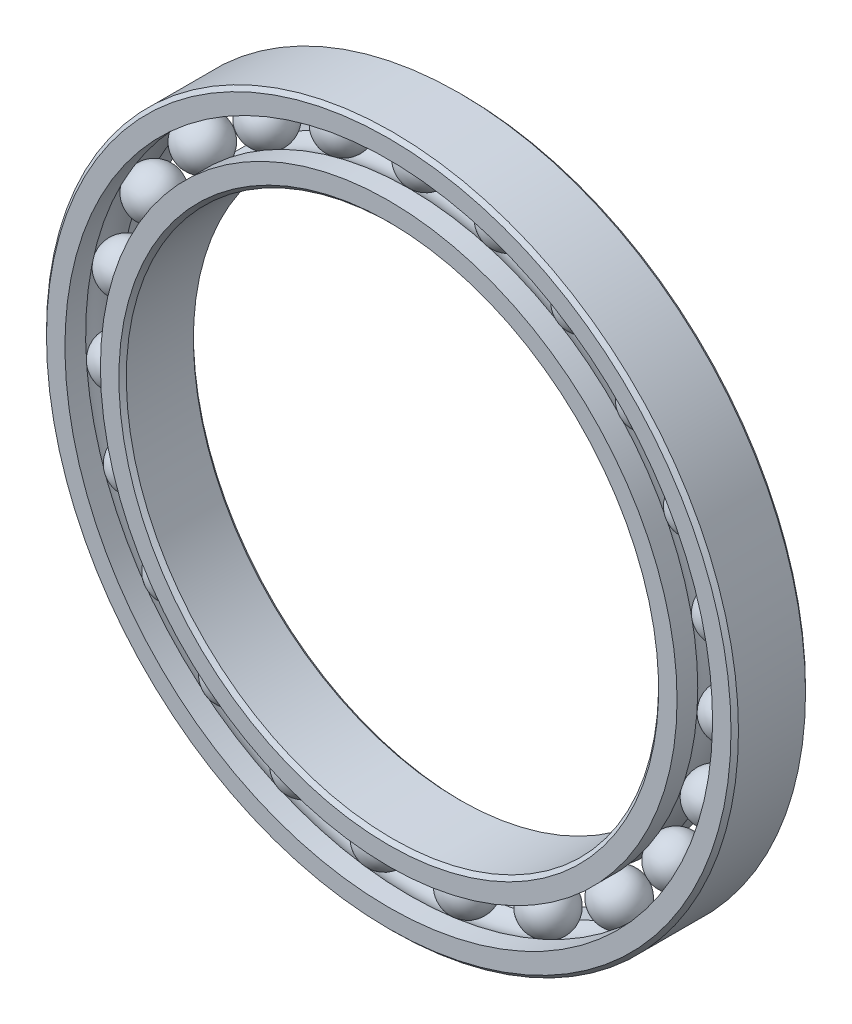
ISO-10303-21;
HEADER;
FILE_DESCRIPTION(('STEP AP214'),'2;1');
FILE_NAME('part.step','',(''),(''),'','','');
FILE_SCHEMA(('AUTOMOTIVE_DESIGN { 1 0 10303 214 1 1 1 1 }'));
ENDSEC;
DATA;
#1=APPLICATION_CONTEXT('core data for automotive mechanical design processes');
#2=APPLICATION_PROTOCOL_DEFINITION('international standard','automotive_design',2000,#1);
#3=PRODUCT_CONTEXT('',#1,'mechanical');
#4=PRODUCT('Part','Part','',(#3));
#5=PRODUCT_RELATED_PRODUCT_CATEGORY('part','',(#4));
#6=PRODUCT_DEFINITION_FORMATION('','',#4);
#7=PRODUCT_DEFINITION_CONTEXT('part definition',#1,'design');
#8=PRODUCT_DEFINITION('design','',#6,#7);
#9=PRODUCT_DEFINITION_SHAPE('','',#8);
#10=(LENGTH_UNIT() NAMED_UNIT(*) SI_UNIT(.MILLI.,.METRE.));
#11=(NAMED_UNIT(*) PLANE_ANGLE_UNIT() SI_UNIT($,.RADIAN.));
#12=(NAMED_UNIT(*) SI_UNIT($,.STERADIAN.) SOLID_ANGLE_UNIT());
#13=UNCERTAINTY_MEASURE_WITH_UNIT(LENGTH_MEASURE(1.E-05),#10,'distance_accuracy_value','');
#14=(GEOMETRIC_REPRESENTATION_CONTEXT(3) GLOBAL_UNCERTAINTY_ASSIGNED_CONTEXT((#13)) GLOBAL_UNIT_ASSIGNED_CONTEXT((#10,
#11,#12)) REPRESENTATION_CONTEXT('',''));
#15=CARTESIAN_POINT('',(0.,0.,0.));
#16=DIRECTION('',(0.,0.,1.));
#17=DIRECTION('',(1.,0.,0.));
#18=AXIS2_PLACEMENT_3D('',#15,#16,#17);
#19=CARTESIAN_POINT('',(7.75665717076408,27.6838720112493,0.));
#20=DIRECTION('',(0.,0.,1.));
#21=DIRECTION('',(0.269796771157012,0.962917287347803,0.));
#22=AXIS2_PLACEMENT_3D('',#19,#20,#21);
#23=SPHERICAL_SURFACE('',#22,2.27980939207591);
#24=CARTESIAN_POINT('',(7.75665717076408,27.6838720112493,2.27980939207591));
#25=VERTEX_POINT('',#24);
#26=VERTEX_LOOP('',#25);
#27=FACE_BOUND('',#26,.T.);
#28=ADVANCED_FACE('F42',(#27),#23,.T.);
#29=CLOSED_SHELL('',(#28));
#30=MANIFOLD_SOLID_BREP('B2',#29);
#31=CARTESIAN_POINT('',(14.9380385635184,24.5645578807117,0.));
#32=DIRECTION('',(0.,0.,1.));
#33=DIRECTION('',(0.519583950035423,0.854419404546495,0.));
#34=AXIS2_PLACEMENT_3D('',#31,#32,#33);
#35=SPHERICAL_SURFACE('',#34,2.27980939207591);
#36=CARTESIAN_POINT('',(14.9380385635184,24.5645578807117,2.27980939207591));
#37=VERTEX_POINT('',#36);
#38=VERTEX_LOOP('',#37);
#39=FACE_BOUND('',#38,.T.);
#40=ADVANCED_FACE('F59',(#39),#35,.T.);
#41=CLOSED_SHELL('',(#40));
#42=MANIFOLD_SOLID_BREP('B6',#41);
#43=CARTESIAN_POINT('',(21.0115339729958,19.6234028675366,0.));
#44=DIRECTION('',(0.,0.,1.));
#45=DIRECTION('',(0.730835964278116,0.682553143218663,0.));
#46=AXIS2_PLACEMENT_3D('',#43,#44,#45);
#47=SPHERICAL_SURFACE('',#46,2.27980939207591);
#48=CARTESIAN_POINT('',(21.0115339729958,19.6234028675366,2.27980939207591));
#49=VERTEX_POINT('',#48);
#50=VERTEX_LOOP('',#49);
#51=FACE_BOUND('',#50,.T.);
#52=ADVANCED_FACE('F76',(#51),#47,.T.);
#53=CLOSED_SHELL('',(#52));
#54=MANIFOLD_SOLID_BREP('B38',#53);
#55=CARTESIAN_POINT('',(25.5267000290681,13.2268698347709,0.));
#56=DIRECTION('',(0.,0.,1.));
#57=DIRECTION('',(0.88788521840237,0.460065037731162,0.));
#58=AXIS2_PLACEMENT_3D('',#55,#56,#57);
#59=SPHERICAL_SURFACE('',#58,2.27980939207591);
#60=CARTESIAN_POINT('',(25.5267000290681,13.2268698347709,2.27980939207591));
#61=VERTEX_POINT('',#60);
#62=VERTEX_LOOP('',#61);
#63=FACE_BOUND('',#62,.T.);
#64=ADVANCED_FACE('F93',(#63),#59,.T.);
#65=CLOSED_SHELL('',(#64));
#66=MANIFOLD_SOLID_BREP('B55',#65);
#67=CARTESIAN_POINT('',(28.1486675208667,5.84936037526353,0.));
#68=DIRECTION('',(0.,0.,1.));
#69=DIRECTION('',(0.979084087682321,0.203456013052645,0.));
#70=AXIS2_PLACEMENT_3D('',#67,#68,#69);
#71=SPHERICAL_SURFACE('',#70,2.27980939207591);
#72=CARTESIAN_POINT('',(28.1486675208667,5.84936037526353,2.2798093920759));
#73=VERTEX_POINT('',#72);
#74=VERTEX_LOOP('',#73);
#75=FACE_BOUND('',#74,.T.);
#76=ADVANCED_FACE('F110',(#75),#71,.T.);
#77=CLOSED_SHELL('',(#76));
#78=MANIFOLD_SOLID_BREP('B72',#77);
#79=CARTESIAN_POINT('',(28.682977114228,-1.961969384234,0.));
#80=DIRECTION('',(0.,0.,1.));
#81=DIRECTION('',(0.99766876919054,-0.0682424133646607,0.));
#82=AXIS2_PLACEMENT_3D('',#79,#80,#81);
#83=SPHERICAL_SURFACE('',#82,2.27980939207591);
#84=CARTESIAN_POINT('',(28.682977114228,-1.961969384234,2.2798093920759));
#85=VERTEX_POINT('',#84);
#86=VERTEX_LOOP('',#85);
#87=FACE_BOUND('',#86,.T.);
#88=ADVANCED_FACE('F127',(#87),#83,.T.);
#89=CLOSED_SHELL('',(#88));
#90=MANIFOLD_SOLID_BREP('B89',#89);
#91=CARTESIAN_POINT('',(27.0900015109162,-9.62778884991559,0.));
#92=DIRECTION('',(0.,0.,1.));
#93=DIRECTION('',(0.942260922118824,-0.334879612170977,0.));
#94=AXIS2_PLACEMENT_3D('',#91,#92,#93);
#95=SPHERICAL_SURFACE('',#94,2.27980939207591);
#96=CARTESIAN_POINT('',(27.0900015109162,-9.62778884991559,2.2798093920759));
#97=VERTEX_POINT('',#96);
#98=VERTEX_LOOP('',#97);
#99=FACE_BOUND('',#98,.T.);
#100=ADVANCED_FACE('F144',(#99),#95,.T.);
#101=CLOSED_SHELL('',(#100));
#102=MANIFOLD_SOLID_BREP('B106',#101);
#103=CARTESIAN_POINT('',(23.4878844240504,-16.5795592608022,0.));
#104=DIRECTION('',(0.,0.,1.));
#105=DIRECTION('',(0.816969893010447,-0.57668032211486,0.));
#106=AXIS2_PLACEMENT_3D('',#103,#104,#105);
#107=SPHERICAL_SURFACE('',#106,2.27980939207591);
#108=CARTESIAN_POINT('',(23.4878844240504,-16.5795592608022,2.2798093920759));
#109=VERTEX_POINT('',#108);
#110=VERTEX_LOOP('',#109);
#111=FACE_BOUND('',#110,.T.);
#112=ADVANCED_FACE('F161',(#111),#107,.T.);
#113=CLOSED_SHELL('',(#112));
#114=MANIFOLD_SOLID_BREP('B123',#113);
#115=CARTESIAN_POINT('',(18.1437783993742,-22.3016996077519,0.));
#116=DIRECTION('',(0.,0.,1.));
#117=DIRECTION('',(0.631087944326059,-0.775711290704414,0.));
#118=AXIS2_PLACEMENT_3D('',#115,#116,#117);
#119=SPHERICAL_SURFACE('',#118,2.27980939207591);
#120=CARTESIAN_POINT('',(18.1437783993742,-22.3016996077519,2.2798093920759));
#121=VERTEX_POINT('',#120);
#122=VERTEX_LOOP('',#121);
#123=FACE_BOUND('',#122,.T.);
#124=ADVANCED_FACE('F178',(#123),#119,.T.);
#125=CLOSED_SHELL('',(#124));
#126=MANIFOLD_SOLID_BREP('B140',#125);
#127=CARTESIAN_POINT('',(11.4540313330796,-26.3698249182817,0.));
#128=DIRECTION('',(0.,0.,1.));
#129=DIRECTION('',(0.398401089846249,-0.91721130150545,0.));
#130=AXIS2_PLACEMENT_3D('',#127,#128,#129);
#131=SPHERICAL_SURFACE('',#130,2.27980939207591);
#132=CARTESIAN_POINT('',(11.4540313330796,-26.3698249182817,2.2798093920759));
#133=VERTEX_POINT('',#132);
#134=VERTEX_LOOP('',#133);
#135=FACE_BOUND('',#134,.T.);
#136=ADVANCED_FACE('F195',(#135),#131,.T.);
#137=CLOSED_SHELL('',(#136));
#138=MANIFOLD_SOLID_BREP('B157',#137);
#139=CARTESIAN_POINT('',(3.9147911615173,-28.4822209485445,0.));
#140=DIRECTION('',(0.,0.,1.));
#141=DIRECTION('',(0.136166649096254,-0.99068594603633,0.));
#142=AXIS2_PLACEMENT_3D('',#139,#140,#141);
#143=SPHERICAL_SURFACE('',#142,2.27980939207591);
#144=CARTESIAN_POINT('',(3.9147911615173,-28.4822209485445,2.2798093920759));
#145=VERTEX_POINT('',#144);
#146=VERTEX_LOOP('',#145);
#147=FACE_BOUND('',#146,.T.);
#148=ADVANCED_FACE('F212',(#147),#143,.T.);
#149=CLOSED_SHELL('',(#148));
#150=MANIFOLD_SOLID_BREP('B174',#149);
#151=CARTESIAN_POINT('',(-3.9147911615169,-28.4822209485445,0.));
#152=DIRECTION('',(0.,0.,1.));
#153=DIRECTION('',(-0.13616664909624,-0.990685946036332,0.));
#154=AXIS2_PLACEMENT_3D('',#151,#152,#153);
#155=SPHERICAL_SURFACE('',#154,2.27980939207591);
#156=CARTESIAN_POINT('',(-3.9147911615169,-28.4822209485445,2.2798093920759));
#157=VERTEX_POINT('',#156);
#158=VERTEX_LOOP('',#157);
#159=FACE_BOUND('',#158,.T.);
#160=ADVANCED_FACE('F229',(#159),#155,.T.);
#161=CLOSED_SHELL('',(#160));
#162=MANIFOLD_SOLID_BREP('B191',#161);
#163=CARTESIAN_POINT('',(-11.4540313330793,-26.3698249182818,0.));
#164=DIRECTION('',(0.,0.,1.));
#165=DIRECTION('',(-0.398401089846236,-0.917211301505455,0.));
#166=AXIS2_PLACEMENT_3D('',#163,#164,#165);
#167=SPHERICAL_SURFACE('',#166,2.27980939207591);
#168=CARTESIAN_POINT('',(-11.4540313330793,-26.3698249182818,2.2798093920759));
#169=VERTEX_POINT('',#168);
#170=VERTEX_LOOP('',#169);
#171=FACE_BOUND('',#170,.T.);
#172=ADVANCED_FACE('F246',(#171),#167,.T.);
#173=CLOSED_SHELL('',(#172));
#174=MANIFOLD_SOLID_BREP('B208',#173);
#175=CARTESIAN_POINT('',(-18.1437783993739,-22.3016996077522,0.));
#176=DIRECTION('',(0.,0.,1.));
#177=DIRECTION('',(-0.631087944326049,-0.775711290704423,0.));
#178=AXIS2_PLACEMENT_3D('',#175,#176,#177);
#179=SPHERICAL_SURFACE('',#178,2.27980939207591);
#180=CARTESIAN_POINT('',(-18.1437783993739,-22.3016996077522,2.2798093920759));
#181=VERTEX_POINT('',#180);
#182=VERTEX_LOOP('',#181);
#183=FACE_BOUND('',#182,.T.);
#184=ADVANCED_FACE('F263',(#183),#179,.T.);
#185=CLOSED_SHELL('',(#184));
#186=MANIFOLD_SOLID_BREP('B225',#185);
#187=CARTESIAN_POINT('',(-23.4878844240501,-16.5795592608025,0.));
#188=DIRECTION('',(0.,0.,1.));
#189=DIRECTION('',(-0.816969893010439,-0.576680322114871,0.));
#190=AXIS2_PLACEMENT_3D('',#187,#188,#189);
#191=SPHERICAL_SURFACE('',#190,2.27980939207591);
#192=CARTESIAN_POINT('',(-23.4878844240501,-16.5795592608025,2.2798093920759));
#193=VERTEX_POINT('',#192);
#194=VERTEX_LOOP('',#193);
#195=FACE_BOUND('',#194,.T.);
#196=ADVANCED_FACE('F280',(#195),#191,.T.);
#197=CLOSED_SHELL('',(#196));
#198=MANIFOLD_SOLID_BREP('B242',#197);
#199=CARTESIAN_POINT('',(-27.0900015109161,-9.62778884991597,0.));
#200=DIRECTION('',(0.,0.,1.));
#201=DIRECTION('',(-0.942260922118819,-0.33487961217099,0.));
#202=AXIS2_PLACEMENT_3D('',#199,#200,#201);
#203=SPHERICAL_SURFACE('',#202,2.27980939207591);
#204=CARTESIAN_POINT('',(-27.0900015109161,-9.62778884991597,2.2798093920759));
#205=VERTEX_POINT('',#204);
#206=VERTEX_LOOP('',#205);
#207=FACE_BOUND('',#206,.T.);
#208=ADVANCED_FACE('F297',(#207),#203,.T.);
#209=CLOSED_SHELL('',(#208));
#210=MANIFOLD_SOLID_BREP('B259',#209);
#211=CARTESIAN_POINT('',(-28.682977114228,-1.9619693842344,0.));
#212=DIRECTION('',(0.,0.,1.));
#213=DIRECTION('',(-0.997668769190539,-0.0682424133646747,0.));
#214=AXIS2_PLACEMENT_3D('',#211,#212,#213);
#215=SPHERICAL_SURFACE('',#214,2.27980939207591);
#216=CARTESIAN_POINT('',(-28.682977114228,-1.9619693842344,2.2798093920759));
#217=VERTEX_POINT('',#216);
#218=VERTEX_LOOP('',#217);
#219=FACE_BOUND('',#218,.T.);
#220=ADVANCED_FACE('F314',(#219),#215,.T.);
#221=CLOSED_SHELL('',(#220));
#222=MANIFOLD_SOLID_BREP('B276',#221);
#223=CARTESIAN_POINT('',(-28.1486675208668,5.84936037526314,0.));
#224=DIRECTION('',(0.,0.,1.));
#225=DIRECTION('',(-0.979084087682323,0.203456013052631,0.));
#226=AXIS2_PLACEMENT_3D('',#223,#224,#225);
#227=SPHERICAL_SURFACE('',#226,2.27980939207591);
#228=CARTESIAN_POINT('',(-28.1486675208668,5.84936037526314,2.2798093920759));
#229=VERTEX_POINT('',#228);
#230=VERTEX_LOOP('',#229);
#231=FACE_BOUND('',#230,.T.);
#232=ADVANCED_FACE('F331',(#231),#227,.T.);
#233=CLOSED_SHELL('',(#232));
#234=MANIFOLD_SOLID_BREP('B293',#233);
#235=CARTESIAN_POINT('',(-25.5267000290683,13.2268698347706,0.));
#236=DIRECTION('',(0.,0.,1.));
#237=DIRECTION('',(-0.887885218402376,0.46006503773115,0.));
#238=AXIS2_PLACEMENT_3D('',#235,#236,#237);
#239=SPHERICAL_SURFACE('',#238,2.27980939207591);
#240=CARTESIAN_POINT('',(-25.5267000290683,13.2268698347706,2.27980939207591));
#241=VERTEX_POINT('',#240);
#242=VERTEX_LOOP('',#241);
#243=FACE_BOUND('',#242,.T.);
#244=ADVANCED_FACE('F348',(#243),#239,.T.);
#245=CLOSED_SHELL('',(#244));
#246=MANIFOLD_SOLID_BREP('B310',#245);
#247=CARTESIAN_POINT('',(-21.0115339729961,19.6234028675363,0.));
#248=DIRECTION('',(0.,0.,1.));
#249=DIRECTION('',(-0.730835964278125,0.682553143218653,0.));
#250=AXIS2_PLACEMENT_3D('',#247,#248,#249);
#251=SPHERICAL_SURFACE('',#250,2.27980939207591);
#252=CARTESIAN_POINT('',(-21.0115339729961,19.6234028675363,2.27980939207591));
#253=VERTEX_POINT('',#252);
#254=VERTEX_LOOP('',#253);
#255=FACE_BOUND('',#254,.T.);
#256=ADVANCED_FACE('F365',(#255),#251,.T.);
#257=CLOSED_SHELL('',(#256));
#258=MANIFOLD_SOLID_BREP('B327',#257);
#259=CARTESIAN_POINT('',(-14.9380385635187,24.5645578807115,0.));
#260=DIRECTION('',(0.,0.,1.));
#261=DIRECTION('',(-0.519583950035435,0.854419404546488,0.));
#262=AXIS2_PLACEMENT_3D('',#259,#260,#261);
#263=SPHERICAL_SURFACE('',#262,2.27980939207591);
#264=CARTESIAN_POINT('',(-14.9380385635187,24.5645578807115,2.27980939207591));
#265=VERTEX_POINT('',#264);
#266=VERTEX_LOOP('',#265);
#267=FACE_BOUND('',#266,.T.);
#268=ADVANCED_FACE('F382',(#267),#263,.T.);
#269=CLOSED_SHELL('',(#268));
#270=MANIFOLD_SOLID_BREP('B344',#269);
#271=CARTESIAN_POINT('',(-7.75665717076446,27.6838720112492,0.));
#272=DIRECTION('',(0.,0.,1.));
#273=DIRECTION('',(-0.269796771157025,0.962917287347799,0.));
#274=AXIS2_PLACEMENT_3D('',#271,#272,#273);
#275=SPHERICAL_SURFACE('',#274,2.27980939207591);
#276=CARTESIAN_POINT('',(-7.75665717076446,27.6838720112492,2.27980939207591));
#277=VERTEX_POINT('',#276);
#278=VERTEX_LOOP('',#277);
#279=FACE_BOUND('',#278,.T.);
#280=ADVANCED_FACE('F399',(#279),#275,.T.);
#281=CLOSED_SHELL('',(#280));
#282=MANIFOLD_SOLID_BREP('B361',#281);
#283=CARTESIAN_POINT('',(0.,28.75,0.));
#284=DIRECTION('',(0.,0.,1.));
#285=DIRECTION('',(0.,1.,0.));
#286=AXIS2_PLACEMENT_3D('',#283,#284,#285);
#287=SPHERICAL_SURFACE('',#286,2.27980939207591);
#288=CARTESIAN_POINT('',(0.,28.75,2.27980939207591));
#289=VERTEX_POINT('',#288);
#290=VERTEX_LOOP('',#289);
#291=FACE_BOUND('',#290,.T.);
#292=ADVANCED_FACE('F418',(#291),#287,.T.);
#293=CLOSED_SHELL('',(#292));
#294=MANIFOLD_SOLID_BREP('B378',#293);
#295=CARTESIAN_POINT('',(0.,27.0833333333333,3.50000000000001));
#296=DIRECTION('',(0.,0.,-1.));
#297=DIRECTION('',(0.,1.,0.));
#298=AXIS2_PLACEMENT_3D('',#295,#296,#297);
#299=PLANE('',#298);
#300=CARTESIAN_POINT('',(0.,0.,3.5));
#301=DIRECTION('',(0.,0.,1.));
#302=DIRECTION('',(0.,-1.,0.));
#303=AXIS2_PLACEMENT_3D('',#300,#301,#302);
#304=CIRCLE('',#303,25.35);
#305=CARTESIAN_POINT('',(0.,-25.35,3.5));
#306=VERTEX_POINT('',#305);
#307=EDGE_CURVE('E464',#306,#306,#304,.T.);
#308=ORIENTED_EDGE('',*,*,#307,.F.);
#309=EDGE_LOOP('',(#308));
#310=FACE_BOUND('',#309,.T.);
#311=CARTESIAN_POINT('',(0.,0.,3.5));
#312=DIRECTION('',(0.,0.,1.));
#313=DIRECTION('',(0.,-1.,0.));
#314=AXIS2_PLACEMENT_3D('',#311,#312,#313);
#315=CIRCLE('',#314,27.0833333333333);
#316=CARTESIAN_POINT('',(0.,-27.0833333333333,3.5));
#317=VERTEX_POINT('',#316);
#318=EDGE_CURVE('E417',#317,#317,#315,.T.);
#319=ORIENTED_EDGE('',*,*,#318,.T.);
#320=EDGE_LOOP('',(#319));
#321=FACE_BOUND('',#320,.T.);
#322=ADVANCED_FACE('F436',(#310,#321),#299,.F.);
#323=CARTESIAN_POINT('',(0.,0.,3.49999999999999));
#324=DIRECTION('',(0.,0.,1.));
#325=DIRECTION('',(0.,-1.,0.));
#326=AXIS2_PLACEMENT_3D('',#323,#324,#325);
#327=CYLINDRICAL_SURFACE('',#326,27.0833333333333);
#328=ORIENTED_EDGE('',*,*,#318,.F.);
#329=EDGE_LOOP('',(#328));
#330=FACE_BOUND('',#329,.T.);
#331=CARTESIAN_POINT('',(0.,0.,1.55555555555555));
#332=DIRECTION('',(0.,0.,1.));
#333=DIRECTION('',(0.,-1.,0.));
#334=AXIS2_PLACEMENT_3D('',#331,#332,#333);
#335=CIRCLE('',#334,27.0833333333333);
#336=CARTESIAN_POINT('',(0.,-27.0833333333333,1.55555555555555));
#337=VERTEX_POINT('',#336);
#338=EDGE_CURVE('E442',#337,#337,#335,.T.);
#339=ORIENTED_EDGE('',*,*,#338,.T.);
#340=EDGE_LOOP('',(#339));
#341=FACE_BOUND('',#340,.T.);
#342=ADVANCED_FACE('F471',(#330,#341),#327,.T.);
#343=CARTESIAN_POINT('',(0.,0.,0.));
#344=DIRECTION('',(0.,0.,1.));
#345=DIRECTION('',(0.,-1.,0.));
#346=AXIS2_PLACEMENT_3D('',#343,#344,#345);
#347=TOROIDAL_SURFACE('',#346,28.75,2.27980939207591);
#348=ORIENTED_EDGE('',*,*,#338,.F.);
#349=EDGE_LOOP('',(#348));
#350=FACE_BOUND('',#349,.T.);
#351=CARTESIAN_POINT('',(0.,0.,-1.55555555555556));
#352=DIRECTION('',(0.,0.,1.));
#353=DIRECTION('',(0.,-1.,0.));
#354=AXIS2_PLACEMENT_3D('',#351,#352,#353);
#355=CIRCLE('',#354,27.0833333333333);
#356=CARTESIAN_POINT('',(0.,-27.0833333333333,-1.55555555555556));
#357=VERTEX_POINT('',#356);
#358=EDGE_CURVE('E446',#357,#357,#355,.T.);
#359=ORIENTED_EDGE('',*,*,#358,.T.);
#360=EDGE_LOOP('',(#359));
#361=FACE_BOUND('',#360,.T.);
#362=ADVANCED_FACE('F475',(#350,#361),#347,.F.);
#363=CARTESIAN_POINT('',(0.,0.,3.49999999999999));
#364=DIRECTION('',(0.,0.,1.));
#365=DIRECTION('',(0.,-1.,0.));
#366=AXIS2_PLACEMENT_3D('',#363,#364,#365);
#367=CYLINDRICAL_SURFACE('',#366,27.0833333333333);
#368=ORIENTED_EDGE('',*,*,#358,.F.);
#369=EDGE_LOOP('',(#368));
#370=FACE_BOUND('',#369,.T.);
#371=CARTESIAN_POINT('',(0.,0.,-3.50000000000001));
#372=DIRECTION('',(0.,0.,1.));
#373=DIRECTION('',(0.,-1.,0.));
#374=AXIS2_PLACEMENT_3D('',#371,#372,#373);
#375=CIRCLE('',#374,27.0833333333333);
#376=CARTESIAN_POINT('',(0.,-27.0833333333333,-3.50000000000002));
#377=VERTEX_POINT('',#376);
#378=EDGE_CURVE('E450',#377,#377,#375,.T.);
#379=ORIENTED_EDGE('',*,*,#378,.T.);
#380=EDGE_LOOP('',(#379));
#381=FACE_BOUND('',#380,.T.);
#382=ADVANCED_FACE('F480',(#370,#381),#367,.T.);
#383=CARTESIAN_POINT('',(0.,25.35,-3.50000000000001));
#384=DIRECTION('',(0.,0.,1.));
#385=DIRECTION('',(0.,-1.,0.));
#386=AXIS2_PLACEMENT_3D('',#383,#384,#385);
#387=PLANE('',#386);
#388=ORIENTED_EDGE('',*,*,#378,.F.);
#389=EDGE_LOOP('',(#388));
#390=FACE_BOUND('',#389,.T.);
#391=CARTESIAN_POINT('',(0.,0.,-3.50000000000002));
#392=DIRECTION('',(0.,0.,1.));
#393=DIRECTION('',(0.,-1.,0.));
#394=AXIS2_PLACEMENT_3D('',#391,#392,#393);
#395=CIRCLE('',#394,25.35);
#396=CARTESIAN_POINT('',(0.,-25.35,-3.50000000000002));
#397=VERTEX_POINT('',#396);
#398=EDGE_CURVE('E455',#397,#397,#395,.T.);
#399=ORIENTED_EDGE('',*,*,#398,.T.);
#400=EDGE_LOOP('',(#399));
#401=FACE_BOUND('',#400,.T.);
#402=ADVANCED_FACE('F486',(#390,#401),#387,.F.);
#403=CARTESIAN_POINT('',(0.,0.,-3.15000000000001));
#404=DIRECTION('',(0.,0.,-1.));
#405=DIRECTION('',(0.,1.,0.));
#406=AXIS2_PLACEMENT_3D('',#403,#404,#405);
#407=CONICAL_SURFACE('',#406,25.,0.785398163397416);
#408=ORIENTED_EDGE('',*,*,#398,.F.);
#409=EDGE_LOOP('',(#408));
#410=FACE_BOUND('',#409,.T.);
#411=CARTESIAN_POINT('',(0.,0.,-3.15000000000001));
#412=DIRECTION('',(0.,0.,1.));
#413=DIRECTION('',(0.,-1.,0.));
#414=AXIS2_PLACEMENT_3D('',#411,#412,#413);
#415=CIRCLE('',#414,25.);
#416=CARTESIAN_POINT('',(0.,-25.,-3.15000000000001));
#417=VERTEX_POINT('',#416);
#418=EDGE_CURVE('E458',#417,#417,#415,.T.);
#419=ORIENTED_EDGE('',*,*,#418,.T.);
#420=EDGE_LOOP('',(#419));
#421=FACE_BOUND('',#420,.T.);
#422=ADVANCED_FACE('F490',(#410,#421),#407,.F.);
#423=CARTESIAN_POINT('',(0.,0.,3.49999999999999));
#424=DIRECTION('',(0.,0.,1.));
#425=DIRECTION('',(0.,-1.,0.));
#426=AXIS2_PLACEMENT_3D('',#423,#424,#425);
#427=CYLINDRICAL_SURFACE('',#426,25.);
#428=ORIENTED_EDGE('',*,*,#418,.F.);
#429=EDGE_LOOP('',(#428));
#430=FACE_BOUND('',#429,.T.);
#431=CARTESIAN_POINT('',(0.,0.,3.15000000000002));
#432=DIRECTION('',(0.,0.,1.));
#433=DIRECTION('',(0.,-1.,0.));
#434=AXIS2_PLACEMENT_3D('',#431,#432,#433);
#435=CIRCLE('',#434,25.);
#436=CARTESIAN_POINT('',(0.,-25.,3.15000000000002));
#437=VERTEX_POINT('',#436);
#438=EDGE_CURVE('E461',#437,#437,#435,.T.);
#439=ORIENTED_EDGE('',*,*,#438,.T.);
#440=EDGE_LOOP('',(#439));
#441=FACE_BOUND('',#440,.T.);
#442=ADVANCED_FACE('F494',(#430,#441),#427,.F.);
#443=CARTESIAN_POINT('',(0.,0.,3.5));
#444=DIRECTION('',(0.,0.,1.));
#445=DIRECTION('',(0.,-1.,0.));
#446=AXIS2_PLACEMENT_3D('',#443,#444,#445);
#447=CONICAL_SURFACE('',#446,25.35,0.785398163397474);
#448=ORIENTED_EDGE('',*,*,#438,.F.);
#449=EDGE_LOOP('',(#448));
#450=FACE_BOUND('',#449,.T.);
#451=ORIENTED_EDGE('',*,*,#307,.T.);
#452=EDGE_LOOP('',(#451));
#453=FACE_BOUND('',#452,.T.);
#454=ADVANCED_FACE('F468',(#450,#453),#447,.F.);
#455=CLOSED_SHELL('',(#322,#342,#362,#382,#402,#422,#442,#454));
#456=MANIFOLD_SOLID_BREP('B395',#455);
#457=CARTESIAN_POINT('',(0.,0.,3.49999999999999));
#458=DIRECTION('',(0.,0.,1.));
#459=DIRECTION('',(0.,-1.,0.));
#460=AXIS2_PLACEMENT_3D('',#457,#458,#459);
#461=CYLINDRICAL_SURFACE('',#460,32.5);
#462=CARTESIAN_POINT('',(0.,0.,3.15));
#463=DIRECTION('',(0.,0.,1.));
#464=DIRECTION('',(0.,-1.,0.));
#465=AXIS2_PLACEMENT_3D('',#462,#463,#464);
#466=CIRCLE('',#465,32.5);
#467=CARTESIAN_POINT('',(0.,-32.5,3.14999999999999));
#468=VERTEX_POINT('',#467);
#469=EDGE_CURVE('E435',#468,#468,#466,.T.);
#470=ORIENTED_EDGE('',*,*,#469,.F.);
#471=EDGE_LOOP('',(#470));
#472=FACE_BOUND('',#471,.T.);
#473=CARTESIAN_POINT('',(0.,0.,-3.15000000000001));
#474=DIRECTION('',(0.,0.,1.));
#475=DIRECTION('',(0.,-1.,0.));
#476=AXIS2_PLACEMENT_3D('',#473,#474,#475);
#477=CIRCLE('',#476,32.5);
#478=CARTESIAN_POINT('',(0.,-32.5,-3.15000000000002));
#479=VERTEX_POINT('',#478);
#480=EDGE_CURVE('E570',#479,#479,#477,.T.);
#481=ORIENTED_EDGE('',*,*,#480,.T.);
#482=EDGE_LOOP('',(#481));
#483=FACE_BOUND('',#482,.T.);
#484=ADVANCED_FACE('F542',(#472,#483),#461,.T.);
#485=CARTESIAN_POINT('',(0.,0.,3.15));
#486=DIRECTION('',(0.,0.,-1.));
#487=DIRECTION('',(0.,1.,0.));
#488=AXIS2_PLACEMENT_3D('',#485,#486,#487);
#489=CONICAL_SURFACE('',#488,32.5,0.785398163397438);
#490=CARTESIAN_POINT('',(0.,0.,3.49999999999999));
#491=DIRECTION('',(0.,0.,1.));
#492=DIRECTION('',(0.,-1.,0.));
#493=AXIS2_PLACEMENT_3D('',#490,#491,#492);
#494=CIRCLE('',#493,32.15);
#495=CARTESIAN_POINT('',(0.,-32.15,3.49999999999999));
#496=VERTEX_POINT('',#495);
#497=EDGE_CURVE('E548',#496,#496,#494,.T.);
#498=ORIENTED_EDGE('',*,*,#497,.F.);
#499=EDGE_LOOP('',(#498));
#500=FACE_BOUND('',#499,.T.);
#501=ORIENTED_EDGE('',*,*,#469,.T.);
#502=EDGE_LOOP('',(#501));
#503=FACE_BOUND('',#502,.T.);
#504=ADVANCED_FACE('F607',(#500,#503),#489,.T.);
#505=CARTESIAN_POINT('',(0.,32.15,3.49999999999999));
#506=DIRECTION('',(0.,0.,-1.));
#507=DIRECTION('',(0.,1.,0.));
#508=AXIS2_PLACEMENT_3D('',#505,#506,#507);
#509=PLANE('',#508);
#510=CARTESIAN_POINT('',(0.,0.,3.49999999999999));
#511=DIRECTION('',(0.,0.,1.));
#512=DIRECTION('',(0.,-1.,0.));
#513=AXIS2_PLACEMENT_3D('',#510,#511,#512);
#514=CIRCLE('',#513,30.4166666666667);
#515=CARTESIAN_POINT('',(0.,-30.4166666666667,3.49999999999998));
#516=VERTEX_POINT('',#515);
#517=EDGE_CURVE('E552',#516,#516,#514,.T.);
#518=ORIENTED_EDGE('',*,*,#517,.F.);
#519=EDGE_LOOP('',(#518));
#520=FACE_BOUND('',#519,.T.);
#521=ORIENTED_EDGE('',*,*,#497,.T.);
#522=EDGE_LOOP('',(#521));
#523=FACE_BOUND('',#522,.T.);
#524=ADVANCED_FACE('F602',(#520,#523),#509,.F.);
#525=CARTESIAN_POINT('',(0.,0.,3.49999999999999));
#526=DIRECTION('',(0.,0.,1.));
#527=DIRECTION('',(0.,-1.,0.));
#528=AXIS2_PLACEMENT_3D('',#525,#526,#527);
#529=CYLINDRICAL_SURFACE('',#528,30.4166666666667);
#530=CARTESIAN_POINT('',(0.,0.,1.55555555555555));
#531=DIRECTION('',(0.,0.,1.));
#532=DIRECTION('',(0.,-1.,0.));
#533=AXIS2_PLACEMENT_3D('',#530,#531,#532);
#534=CIRCLE('',#533,30.4166666666667);
#535=CARTESIAN_POINT('',(0.,-30.4166666666667,1.55555555555554));
#536=VERTEX_POINT('',#535);
#537=EDGE_CURVE('E556',#536,#536,#534,.T.);
#538=ORIENTED_EDGE('',*,*,#537,.F.);
#539=EDGE_LOOP('',(#538));
#540=FACE_BOUND('',#539,.T.);
#541=ORIENTED_EDGE('',*,*,#517,.T.);
#542=EDGE_LOOP('',(#541));
#543=FACE_BOUND('',#542,.T.);
#544=ADVANCED_FACE('F596',(#540,#543),#529,.F.);
#545=CARTESIAN_POINT('',(0.,0.,0.));
#546=DIRECTION('',(0.,0.,1.));
#547=DIRECTION('',(0.,-1.,0.));
#548=AXIS2_PLACEMENT_3D('',#545,#546,#547);
#549=TOROIDAL_SURFACE('',#548,28.75,2.27980939207591);
#550=CARTESIAN_POINT('',(0.,0.,-1.55555555555556));
#551=DIRECTION('',(0.,0.,1.));
#552=DIRECTION('',(0.,-1.,0.));
#553=AXIS2_PLACEMENT_3D('',#550,#551,#552);
#554=CIRCLE('',#553,30.4166666666667);
#555=CARTESIAN_POINT('',(0.,-30.4166666666667,-1.55555555555557));
#556=VERTEX_POINT('',#555);
#557=EDGE_CURVE('E561',#556,#556,#554,.T.);
#558=ORIENTED_EDGE('',*,*,#557,.F.);
#559=EDGE_LOOP('',(#558));
#560=FACE_BOUND('',#559,.T.);
#561=ORIENTED_EDGE('',*,*,#537,.T.);
#562=EDGE_LOOP('',(#561));
#563=FACE_BOUND('',#562,.T.);
#564=ADVANCED_FACE('F590',(#560,#563),#549,.F.);
#565=CARTESIAN_POINT('',(0.,0.,3.49999999999999));
#566=DIRECTION('',(0.,0.,1.));
#567=DIRECTION('',(0.,-1.,0.));
#568=AXIS2_PLACEMENT_3D('',#565,#566,#567);
#569=CYLINDRICAL_SURFACE('',#568,30.4166666666667);
#570=CARTESIAN_POINT('',(0.,0.,-3.5));
#571=DIRECTION('',(0.,0.,1.));
#572=DIRECTION('',(0.,-1.,0.));
#573=AXIS2_PLACEMENT_3D('',#570,#571,#572);
#574=CIRCLE('',#573,30.4166666666667);
#575=CARTESIAN_POINT('',(0.,-30.4166666666667,-3.50000000000001));
#576=VERTEX_POINT('',#575);
#577=EDGE_CURVE('E564',#576,#576,#574,.T.);
#578=ORIENTED_EDGE('',*,*,#577,.F.);
#579=EDGE_LOOP('',(#578));
#580=FACE_BOUND('',#579,.T.);
#581=ORIENTED_EDGE('',*,*,#557,.T.);
#582=EDGE_LOOP('',(#581));
#583=FACE_BOUND('',#582,.T.);
#584=ADVANCED_FACE('F584',(#580,#583),#569,.F.);
#585=CARTESIAN_POINT('',(0.,32.15,-3.5));
#586=DIRECTION('',(0.,0.,1.));
#587=DIRECTION('',(0.,-1.,0.));
#588=AXIS2_PLACEMENT_3D('',#585,#586,#587);
#589=PLANE('',#588);
#590=CARTESIAN_POINT('',(0.,0.,-3.50000000000001));
#591=DIRECTION('',(0.,0.,1.));
#592=DIRECTION('',(0.,-1.,0.));
#593=AXIS2_PLACEMENT_3D('',#590,#591,#592);
#594=CIRCLE('',#593,32.15);
#595=CARTESIAN_POINT('',(0.,-32.15,-3.50000000000001));
#596=VERTEX_POINT('',#595);
#597=EDGE_CURVE('E567',#596,#596,#594,.T.);
#598=ORIENTED_EDGE('',*,*,#597,.F.);
#599=EDGE_LOOP('',(#598));
#600=FACE_BOUND('',#599,.T.);
#601=ORIENTED_EDGE('',*,*,#577,.T.);
#602=EDGE_LOOP('',(#601));
#603=FACE_BOUND('',#602,.T.);
#604=ADVANCED_FACE('F578',(#600,#603),#589,.F.);
#605=CARTESIAN_POINT('',(0.,0.,-3.50000000000001));
#606=DIRECTION('',(0.,0.,1.));
#607=DIRECTION('',(0.,-1.,0.));
#608=AXIS2_PLACEMENT_3D('',#605,#606,#607);
#609=CONICAL_SURFACE('',#608,32.15,0.785398163397438);
#610=ORIENTED_EDGE('',*,*,#480,.F.);
#611=EDGE_LOOP('',(#610));
#612=FACE_BOUND('',#611,.T.);
#613=ORIENTED_EDGE('',*,*,#597,.T.);
#614=EDGE_LOOP('',(#613));
#615=FACE_BOUND('',#614,.T.);
#616=ADVANCED_FACE('F575',(#612,#615),#609,.T.);
#617=CLOSED_SHELL('',(#484,#504,#524,#544,#564,#584,#604,#616));
#618=MANIFOLD_SOLID_BREP('B412',#617);
#619=ADVANCED_BREP_SHAPE_REPRESENTATION('',(#18,#30,#42,#54,#66,#78,#90,#102,#114,#126,#138,
#150,#162,#174,#186,#198,#210,#222,#234,#246,#258,#270,#282,#294,#456,#618),#14);
#620=SHAPE_DEFINITION_REPRESENTATION(#9,#619);
ENDSEC;
END-ISO-10303-21;
